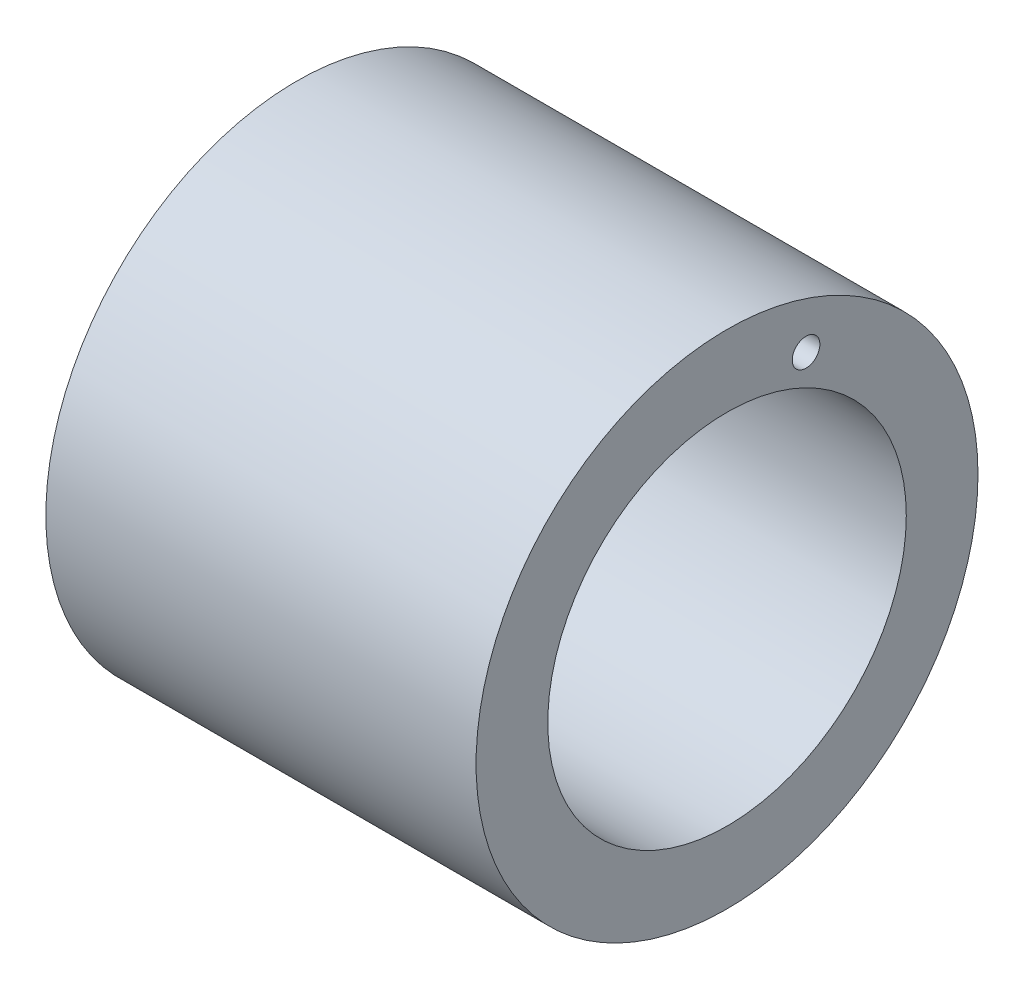
ISO-10303-21;
HEADER;
FILE_DESCRIPTION(('STEP AP214'),'2;1');
FILE_NAME('part.step','',(''),(''),'','','');
FILE_SCHEMA(('AUTOMOTIVE_DESIGN { 1 0 10303 214 1 1 1 1 }'));
ENDSEC;
DATA;
#1=APPLICATION_CONTEXT('core data for automotive mechanical design processes');
#2=APPLICATION_PROTOCOL_DEFINITION('international standard','automotive_design',2000,#1);
#3=PRODUCT_CONTEXT('',#1,'mechanical');
#4=PRODUCT('Part','Part','',(#3));
#5=PRODUCT_RELATED_PRODUCT_CATEGORY('part','',(#4));
#6=PRODUCT_DEFINITION_FORMATION('','',#4);
#7=PRODUCT_DEFINITION_CONTEXT('part definition',#1,'design');
#8=PRODUCT_DEFINITION('design','',#6,#7);
#9=PRODUCT_DEFINITION_SHAPE('','',#8);
#10=(LENGTH_UNIT() NAMED_UNIT(*) SI_UNIT(.MILLI.,.METRE.));
#11=(NAMED_UNIT(*) PLANE_ANGLE_UNIT() SI_UNIT($,.RADIAN.));
#12=(NAMED_UNIT(*) SI_UNIT($,.STERADIAN.) SOLID_ANGLE_UNIT());
#13=UNCERTAINTY_MEASURE_WITH_UNIT(LENGTH_MEASURE(1.E-05),#10,'distance_accuracy_value','');
#14=(GEOMETRIC_REPRESENTATION_CONTEXT(3) GLOBAL_UNCERTAINTY_ASSIGNED_CONTEXT((#13)) GLOBAL_UNIT_ASSIGNED_CONTEXT((#10,
#11,#12)) REPRESENTATION_CONTEXT('',''));
#15=CARTESIAN_POINT('',(0.,0.,0.));
#16=DIRECTION('',(0.,0.,1.));
#17=DIRECTION('',(1.,0.,0.));
#18=AXIS2_PLACEMENT_3D('',#15,#16,#17);
#19=CARTESIAN_POINT('',(24.,0.,0.));
#20=DIRECTION('',(1.,0.,0.));
#21=DIRECTION('',(0.,0.,-1.));
#22=AXIS2_PLACEMENT_3D('',#19,#20,#21);
#23=PLANE('',#22);
#24=CARTESIAN_POINT('',(24.,10.6930325358476,-4.40787916675589));
#25=DIRECTION('',(1.,0.,0.));
#26=DIRECTION('',(0.,0.,-1.));
#27=AXIS2_PLACEMENT_3D('',#24,#25,#26);
#28=CIRCLE('',#27,0.770719989887425);
#29=CARTESIAN_POINT('',(24.,10.6930325358476,-5.17859915664332));
#30=VERTEX_POINT('',#29);
#31=EDGE_CURVE('E56',#30,#30,#28,.T.);
#32=ORIENTED_EDGE('',*,*,#31,.F.);
#33=EDGE_LOOP('',(#32));
#34=FACE_BOUND('',#33,.T.);
#35=CARTESIAN_POINT('',(24.,0.,0.));
#36=DIRECTION('',(1.,0.,0.));
#37=DIRECTION('',(0.,0.,-1.));
#38=AXIS2_PLACEMENT_3D('',#35,#36,#37);
#39=CIRCLE('',#38,14.);
#40=CARTESIAN_POINT('',(24.,0.,-14.));
#41=VERTEX_POINT('',#40);
#42=EDGE_CURVE('E11',#41,#41,#39,.T.);
#43=ORIENTED_EDGE('',*,*,#42,.T.);
#44=EDGE_LOOP('',(#43));
#45=FACE_BOUND('',#44,.T.);
#46=CARTESIAN_POINT('',(24.,0.,0.));
#47=DIRECTION('',(1.,0.,0.));
#48=DIRECTION('',(0.,0.,-1.));
#49=AXIS2_PLACEMENT_3D('',#46,#47,#48);
#50=CIRCLE('',#49,10.);
#51=CARTESIAN_POINT('',(24.,0.,-10.));
#52=VERTEX_POINT('',#51);
#53=EDGE_CURVE('E48',#52,#52,#50,.T.);
#54=ORIENTED_EDGE('',*,*,#53,.F.);
#55=EDGE_LOOP('',(#54));
#56=FACE_BOUND('',#55,.T.);
#57=ADVANCED_FACE('F37',(#34,#45,#56),#23,.T.);
#58=CARTESIAN_POINT('',(0.,0.,0.));
#59=DIRECTION('',(1.,0.,0.));
#60=DIRECTION('',(0.,0.,-1.));
#61=AXIS2_PLACEMENT_3D('',#58,#59,#60);
#62=PLANE('',#61);
#63=CARTESIAN_POINT('',(0.,0.,0.));
#64=DIRECTION('',(1.,0.,0.));
#65=DIRECTION('',(0.,0.,-1.));
#66=AXIS2_PLACEMENT_3D('',#63,#64,#65);
#67=CIRCLE('',#66,14.);
#68=CARTESIAN_POINT('',(0.,0.,-14.));
#69=VERTEX_POINT('',#68);
#70=EDGE_CURVE('E41',#69,#69,#67,.T.);
#71=ORIENTED_EDGE('',*,*,#70,.F.);
#72=EDGE_LOOP('',(#71));
#73=FACE_BOUND('',#72,.T.);
#74=CARTESIAN_POINT('',(0.,0.,0.));
#75=DIRECTION('',(1.,0.,0.));
#76=DIRECTION('',(0.,0.,-1.));
#77=AXIS2_PLACEMENT_3D('',#74,#75,#76);
#78=CIRCLE('',#77,10.);
#79=CARTESIAN_POINT('',(0.,0.,-10.));
#80=VERTEX_POINT('',#79);
#81=EDGE_CURVE('E50',#80,#80,#78,.T.);
#82=ORIENTED_EDGE('',*,*,#81,.T.);
#83=EDGE_LOOP('',(#82));
#84=FACE_BOUND('',#83,.T.);
#85=ADVANCED_FACE('F72',(#73,#84),#62,.F.);
#86=CARTESIAN_POINT('',(24.,0.,0.));
#87=DIRECTION('',(-1.,0.,0.));
#88=DIRECTION('',(0.,0.,1.));
#89=AXIS2_PLACEMENT_3D('',#86,#87,#88);
#90=CYLINDRICAL_SURFACE('',#89,14.);
#91=ORIENTED_EDGE('',*,*,#42,.F.);
#92=EDGE_LOOP('',(#91));
#93=FACE_BOUND('',#92,.T.);
#94=ORIENTED_EDGE('',*,*,#70,.T.);
#95=EDGE_LOOP('',(#94));
#96=FACE_BOUND('',#95,.T.);
#97=ADVANCED_FACE('F39',(#93,#96),#90,.T.);
#98=CARTESIAN_POINT('',(24.,0.,0.));
#99=DIRECTION('',(-1.,0.,0.));
#100=DIRECTION('',(0.,0.,1.));
#101=AXIS2_PLACEMENT_3D('',#98,#99,#100);
#102=CYLINDRICAL_SURFACE('',#101,10.);
#103=ORIENTED_EDGE('',*,*,#53,.T.);
#104=EDGE_LOOP('',(#103));
#105=FACE_BOUND('',#104,.T.);
#106=ORIENTED_EDGE('',*,*,#81,.F.);
#107=EDGE_LOOP('',(#106));
#108=FACE_BOUND('',#107,.T.);
#109=ADVANCED_FACE('F67',(#105,#108),#102,.F.);
#110=CARTESIAN_POINT('',(14.,10.6930325358476,-4.40787916675589));
#111=DIRECTION('',(1.,0.,0.));
#112=DIRECTION('',(0.,0.,-1.));
#113=AXIS2_PLACEMENT_3D('',#110,#111,#112);
#114=CYLINDRICAL_SURFACE('',#113,0.770719989887425);
#115=CARTESIAN_POINT('',(14.,10.6930325358476,-4.40787916675589));
#116=DIRECTION('',(1.,0.,0.));
#117=DIRECTION('',(0.,0.,-1.));
#118=AXIS2_PLACEMENT_3D('',#115,#116,#117);
#119=CIRCLE('',#118,0.770719989887425);
#120=CARTESIAN_POINT('',(14.,10.6930325358476,-5.17859915664332));
#121=VERTEX_POINT('',#120);
#122=EDGE_CURVE('E53',#121,#121,#119,.T.);
#123=ORIENTED_EDGE('',*,*,#122,.F.);
#124=EDGE_LOOP('',(#123));
#125=FACE_BOUND('',#124,.T.);
#126=ORIENTED_EDGE('',*,*,#31,.T.);
#127=EDGE_LOOP('',(#126));
#128=FACE_BOUND('',#127,.T.);
#129=ADVANCED_FACE('F64',(#125,#128),#114,.F.);
#130=CARTESIAN_POINT('',(14.,10.6930325358476,-4.40787916675589));
#131=DIRECTION('',(1.,0.,0.));
#132=DIRECTION('',(0.,0.,-1.));
#133=AXIS2_PLACEMENT_3D('',#130,#131,#132);
#134=PLANE('',#133);
#135=ORIENTED_EDGE('',*,*,#122,.T.);
#136=EDGE_LOOP('',(#135));
#137=FACE_BOUND('',#136,.T.);
#138=ADVANCED_FACE('F62',(#137),#134,.T.);
#139=CLOSED_SHELL('',(#57,#85,#97,#109,#129,#138));
#140=MANIFOLD_SOLID_BREP('B2',#139);
#141=ADVANCED_BREP_SHAPE_REPRESENTATION('',(#18,#140),#14);
#142=SHAPE_DEFINITION_REPRESENTATION(#9,#141);
ENDSEC;
END-ISO-10303-21;
